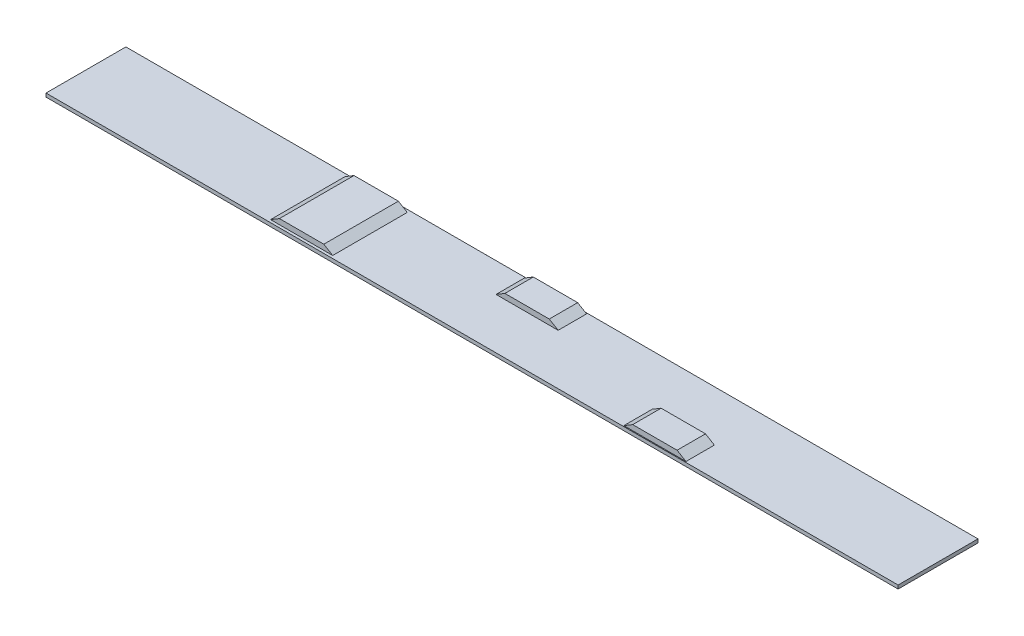
ISO-10303-21;
HEADER;
FILE_DESCRIPTION(('STEP AP214'),'2;1');
FILE_NAME('part.step','',(''),(''),'','','');
FILE_SCHEMA(('AUTOMOTIVE_DESIGN { 1 0 10303 214 1 1 1 1 }'));
ENDSEC;
DATA;
#1=APPLICATION_CONTEXT('core data for automotive mechanical design processes');
#2=APPLICATION_PROTOCOL_DEFINITION('international standard','automotive_design',2000,#1);
#3=PRODUCT_CONTEXT('',#1,'mechanical');
#4=PRODUCT('Part','Part','',(#3));
#5=PRODUCT_RELATED_PRODUCT_CATEGORY('part','',(#4));
#6=PRODUCT_DEFINITION_FORMATION('','',#4);
#7=PRODUCT_DEFINITION_CONTEXT('part definition',#1,'design');
#8=PRODUCT_DEFINITION('design','',#6,#7);
#9=PRODUCT_DEFINITION_SHAPE('','',#8);
#10=(LENGTH_UNIT() NAMED_UNIT(*) SI_UNIT(.MILLI.,.METRE.));
#11=(NAMED_UNIT(*) PLANE_ANGLE_UNIT() SI_UNIT($,.RADIAN.));
#12=(NAMED_UNIT(*) SI_UNIT($,.STERADIAN.) SOLID_ANGLE_UNIT());
#13=UNCERTAINTY_MEASURE_WITH_UNIT(LENGTH_MEASURE(1.E-05),#10,'distance_accuracy_value','');
#14=(GEOMETRIC_REPRESENTATION_CONTEXT(3) GLOBAL_UNCERTAINTY_ASSIGNED_CONTEXT((#13)) GLOBAL_UNIT_ASSIGNED_CONTEXT((#10,
#11,#12)) REPRESENTATION_CONTEXT('',''));
#15=CARTESIAN_POINT('',(0.,0.,0.));
#16=DIRECTION('',(0.,0.,1.));
#17=DIRECTION('',(1.,0.,0.));
#18=AXIS2_PLACEMENT_3D('',#15,#16,#17);
#19=CARTESIAN_POINT('',(0.,10.,0.));
#20=DIRECTION('',(0.,1.,0.));
#21=DIRECTION('',(0.,0.,1.));
#22=AXIS2_PLACEMENT_3D('',#19,#20,#21);
#23=PLANE('',#22);
#24=DIRECTION('',(1.,0.,0.));
#25=VECTOR('',#24,1.);
#26=CARTESIAN_POINT('',(-575.000000000001,9.99999999999651,-105.));
#27=LINE('',#26,#25);
#28=CARTESIAN_POINT('',(-575.000000000001,9.99999999999651,-105.));
#29=VERTEX_POINT('',#28);
#30=CARTESIAN_POINT('',(-400.000000000001,9.99999999999302,-105.));
#31=VERTEX_POINT('',#30);
#32=EDGE_CURVE('E180',#29,#31,#27,.T.);
#33=ORIENTED_EDGE('',*,*,#32,.T.);
#34=DIRECTION('',(0.,0.,1.));
#35=VECTOR('',#34,1.);
#36=CARTESIAN_POINT('',(-400.000000000001,9.99999999999302,-105.));
#37=LINE('',#36,#35);
#38=CARTESIAN_POINT('',(-400.000000000001,9.99999999999302,105.));
#39=VERTEX_POINT('',#38);
#40=EDGE_CURVE('E172',#31,#39,#37,.T.);
#41=ORIENTED_EDGE('',*,*,#40,.T.);
#42=DIRECTION('',(1.,0.,0.));
#43=VECTOR('',#42,1.);
#44=CARTESIAN_POINT('',(-575.000000000001,9.99999999999651,105.));
#45=LINE('',#44,#43);
#46=CARTESIAN_POINT('',(-575.000000000001,10.,105.));
#47=VERTEX_POINT('',#46);
#48=EDGE_CURVE('E159',#47,#39,#45,.T.);
#49=ORIENTED_EDGE('',*,*,#48,.F.);
#50=DIRECTION('',(0.,0.,1.));
#51=VECTOR('',#50,1.);
#52=CARTESIAN_POINT('',(-575.000000000001,9.99999999999651,-105.));
#53=LINE('',#52,#51);
#54=EDGE_CURVE('E182',#29,#47,#53,.T.);
#55=ORIENTED_EDGE('',*,*,#54,.F.);
#56=EDGE_LOOP('',(#33,#41,#49,#55));
#57=FACE_BOUND('',#56,.T.);
#58=DIRECTION('',(0.,0.,-1.));
#59=VECTOR('',#58,1.);
#60=CARTESIAN_POINT('',(1200.,10.,-112.5));
#61=LINE('',#60,#59);
#62=CARTESIAN_POINT('',(1200.,10.,112.5));
#63=VERTEX_POINT('',#62);
#64=CARTESIAN_POINT('',(1200.,10.,-112.5));
#65=VERTEX_POINT('',#64);
#66=EDGE_CURVE('E277',#63,#65,#61,.T.);
#67=ORIENTED_EDGE('',*,*,#66,.T.);
#68=DIRECTION('',(-1.,0.,0.));
#69=VECTOR('',#68,1.);
#70=CARTESIAN_POINT('',(-1200.,10.,-112.5));
#71=LINE('',#70,#69);
#72=CARTESIAN_POINT('',(-1200.,10.,-112.5));
#73=VERTEX_POINT('',#72);
#74=EDGE_CURVE('E281',#65,#73,#71,.T.);
#75=ORIENTED_EDGE('',*,*,#74,.T.);
#76=DIRECTION('',(0.,0.,1.));
#77=VECTOR('',#76,1.);
#78=CARTESIAN_POINT('',(-1200.,10.,-112.5));
#79=LINE('',#78,#77);
#80=CARTESIAN_POINT('',(-1200.,10.,112.5));
#81=VERTEX_POINT('',#80);
#82=EDGE_CURVE('E285',#73,#81,#79,.T.);
#83=ORIENTED_EDGE('',*,*,#82,.T.);
#84=DIRECTION('',(1.,0.,0.));
#85=VECTOR('',#84,1.);
#86=CARTESIAN_POINT('',(-1200.,10.,112.5));
#87=LINE('',#86,#85);
#88=EDGE_CURVE('E288',#81,#63,#87,.T.);
#89=ORIENTED_EDGE('',*,*,#88,.T.);
#90=EDGE_LOOP('',(#67,#75,#83,#89));
#91=FACE_BOUND('',#90,.T.);
#92=DIRECTION('',(0.,0.,-1.));
#93=VECTOR('',#92,1.);
#94=CARTESIAN_POINT('',(599.999999999999,10.,110.));
#95=LINE('',#94,#93);
#96=CARTESIAN_POINT('',(599.999999999999,10.,110.));
#97=VERTEX_POINT('',#96);
#98=CARTESIAN_POINT('',(599.999999999999,10.,30.));
#99=VERTEX_POINT('',#98);
#100=EDGE_CURVE('E269',#97,#99,#95,.T.);
#101=ORIENTED_EDGE('',*,*,#100,.F.);
#102=DIRECTION('',(1.,0.,0.));
#103=VECTOR('',#102,1.);
#104=CARTESIAN_POINT('',(424.999999999999,10.,110.));
#105=LINE('',#104,#103);
#106=CARTESIAN_POINT('',(424.999999999999,10.,110.));
#107=VERTEX_POINT('',#106);
#108=EDGE_CURVE('E239',#107,#97,#105,.T.);
#109=ORIENTED_EDGE('',*,*,#108,.F.);
#110=DIRECTION('',(0.,0.,-1.));
#111=VECTOR('',#110,1.);
#112=CARTESIAN_POINT('',(424.999999999999,10.,110.));
#113=LINE('',#112,#111);
#114=CARTESIAN_POINT('',(424.999999999999,10.,30.));
#115=VERTEX_POINT('',#114);
#116=EDGE_CURVE('E273',#107,#115,#113,.T.);
#117=ORIENTED_EDGE('',*,*,#116,.T.);
#118=DIRECTION('',(1.,0.,0.));
#119=VECTOR('',#118,1.);
#120=CARTESIAN_POINT('',(424.999999999999,10.,30.));
#121=LINE('',#120,#119);
#122=EDGE_CURVE('E254',#115,#99,#121,.T.);
#123=ORIENTED_EDGE('',*,*,#122,.T.);
#124=EDGE_LOOP('',(#101,#109,#117,#123));
#125=FACE_BOUND('',#124,.T.);
#126=DIRECTION('',(0.,0.,1.));
#127=VECTOR('',#126,1.);
#128=CARTESIAN_POINT('',(-75.0000000000013,9.99999999999651,-110.));
#129=LINE('',#128,#127);
#130=CARTESIAN_POINT('',(-74.9999999999955,10.,-110.));
#131=VERTEX_POINT('',#130);
#132=CARTESIAN_POINT('',(-75.0000000000013,10.,-30.));
#133=VERTEX_POINT('',#132);
#134=EDGE_CURVE('E69',#131,#133,#129,.T.);
#135=ORIENTED_EDGE('',*,*,#134,.F.);
#136=DIRECTION('',(1.,0.,0.));
#137=VECTOR('',#136,1.);
#138=CARTESIAN_POINT('',(-75.0000000000013,9.99999999999651,-110.));
#139=LINE('',#138,#137);
#140=CARTESIAN_POINT('',(99.9999999999929,10.,-110.));
#141=VERTEX_POINT('',#140);
#142=EDGE_CURVE('E192',#131,#141,#139,.T.);
#143=ORIENTED_EDGE('',*,*,#142,.T.);
#144=DIRECTION('',(0.,0.,1.));
#145=VECTOR('',#144,1.);
#146=CARTESIAN_POINT('',(99.9999999999987,9.99999999999651,-110.));
#147=LINE('',#146,#145);
#148=CARTESIAN_POINT('',(99.9999999999987,9.99999999999651,-30.));
#149=VERTEX_POINT('',#148);
#150=EDGE_CURVE('E208',#141,#149,#147,.T.);
#151=ORIENTED_EDGE('',*,*,#150,.T.);
#152=DIRECTION('',(1.,0.,0.));
#153=VECTOR('',#152,1.);
#154=CARTESIAN_POINT('',(-75.0000000000013,9.99999999999651,-30.));
#155=LINE('',#154,#153);
#156=EDGE_CURVE('E209',#133,#149,#155,.T.);
#157=ORIENTED_EDGE('',*,*,#156,.F.);
#158=EDGE_LOOP('',(#135,#143,#151,#157));
#159=FACE_BOUND('',#158,.T.);
#160=ADVANCED_FACE('F45',(#57,#91,#125,#159),#23,.T.);
#161=CARTESIAN_POINT('',(1200.,10.,-112.5));
#162=DIRECTION('',(-1.,0.,0.));
#163=DIRECTION('',(0.,0.,1.));
#164=AXIS2_PLACEMENT_3D('',#161,#162,#163);
#165=PLANE('',#164);
#166=DIRECTION('',(0.,0.,-1.));
#167=VECTOR('',#166,1.);
#168=CARTESIAN_POINT('',(1200.,0.,-112.5));
#169=LINE('',#168,#167);
#170=CARTESIAN_POINT('',(1200.,0.,112.5));
#171=VERTEX_POINT('',#170);
#172=CARTESIAN_POINT('',(1200.,0.,-112.5));
#173=VERTEX_POINT('',#172);
#174=EDGE_CURVE('E276',#171,#173,#169,.T.);
#175=ORIENTED_EDGE('',*,*,#174,.T.);
#176=DIRECTION('',(0.,-1.,0.));
#177=VECTOR('',#176,1.);
#178=CARTESIAN_POINT('',(1200.,10.,-112.5));
#179=LINE('',#178,#177);
#180=EDGE_CURVE('E11',#65,#173,#179,.T.);
#181=ORIENTED_EDGE('',*,*,#180,.F.);
#182=ORIENTED_EDGE('',*,*,#66,.F.);
#183=DIRECTION('',(0.,-1.,0.));
#184=VECTOR('',#183,1.);
#185=CARTESIAN_POINT('',(1200.,10.,112.5));
#186=LINE('',#185,#184);
#187=EDGE_CURVE('E291',#63,#171,#186,.T.);
#188=ORIENTED_EDGE('',*,*,#187,.T.);
#189=EDGE_LOOP('',(#175,#181,#182,#188));
#190=FACE_BOUND('',#189,.T.);
#191=ADVANCED_FACE('F47',(#190),#165,.F.);
#192=CARTESIAN_POINT('',(-1200.,10.,-112.5));
#193=DIRECTION('',(0.,0.,1.));
#194=DIRECTION('',(1.,0.,0.));
#195=AXIS2_PLACEMENT_3D('',#192,#193,#194);
#196=PLANE('',#195);
#197=DIRECTION('',(-1.,0.,0.));
#198=VECTOR('',#197,1.);
#199=CARTESIAN_POINT('',(-1200.,0.,-112.5));
#200=LINE('',#199,#198);
#201=CARTESIAN_POINT('',(-1200.,0.,-112.5));
#202=VERTEX_POINT('',#201);
#203=EDGE_CURVE('E295',#173,#202,#200,.T.);
#204=ORIENTED_EDGE('',*,*,#203,.T.);
#205=DIRECTION('',(0.,-1.,0.));
#206=VECTOR('',#205,1.);
#207=CARTESIAN_POINT('',(-1200.,10.,-112.5));
#208=LINE('',#207,#206);
#209=EDGE_CURVE('E54',#73,#202,#208,.T.);
#210=ORIENTED_EDGE('',*,*,#209,.F.);
#211=ORIENTED_EDGE('',*,*,#74,.F.);
#212=ORIENTED_EDGE('',*,*,#180,.T.);
#213=EDGE_LOOP('',(#204,#210,#211,#212));
#214=FACE_BOUND('',#213,.T.);
#215=ADVANCED_FACE('F330',(#214),#196,.F.);
#216=CARTESIAN_POINT('',(-1200.,10.,-112.5));
#217=DIRECTION('',(1.,0.,0.));
#218=DIRECTION('',(0.,0.,-1.));
#219=AXIS2_PLACEMENT_3D('',#216,#217,#218);
#220=PLANE('',#219);
#221=DIRECTION('',(0.,0.,1.));
#222=VECTOR('',#221,1.);
#223=CARTESIAN_POINT('',(-1200.,0.,-112.5));
#224=LINE('',#223,#222);
#225=CARTESIAN_POINT('',(-1200.,0.,112.5));
#226=VERTEX_POINT('',#225);
#227=EDGE_CURVE('E298',#202,#226,#224,.T.);
#228=ORIENTED_EDGE('',*,*,#227,.T.);
#229=DIRECTION('',(0.,-1.,0.));
#230=VECTOR('',#229,1.);
#231=CARTESIAN_POINT('',(-1200.,10.,112.5));
#232=LINE('',#231,#230);
#233=EDGE_CURVE('E306',#81,#226,#232,.T.);
#234=ORIENTED_EDGE('',*,*,#233,.F.);
#235=ORIENTED_EDGE('',*,*,#82,.F.);
#236=ORIENTED_EDGE('',*,*,#209,.T.);
#237=EDGE_LOOP('',(#228,#234,#235,#236));
#238=FACE_BOUND('',#237,.T.);
#239=ADVANCED_FACE('F315',(#238),#220,.F.);
#240=CARTESIAN_POINT('',(-1200.,10.,112.5));
#241=DIRECTION('',(0.,0.,-1.));
#242=DIRECTION('',(-1.,0.,0.));
#243=AXIS2_PLACEMENT_3D('',#240,#241,#242);
#244=PLANE('',#243);
#245=DIRECTION('',(1.,0.,0.));
#246=VECTOR('',#245,1.);
#247=CARTESIAN_POINT('',(-1200.,0.,112.5));
#248=LINE('',#247,#246);
#249=EDGE_CURVE('E282',#226,#171,#248,.T.);
#250=ORIENTED_EDGE('',*,*,#249,.T.);
#251=ORIENTED_EDGE('',*,*,#187,.F.);
#252=ORIENTED_EDGE('',*,*,#88,.F.);
#253=ORIENTED_EDGE('',*,*,#233,.T.);
#254=EDGE_LOOP('',(#250,#251,#252,#253));
#255=FACE_BOUND('',#254,.T.);
#256=ADVANCED_FACE('F324',(#255),#244,.F.);
#257=CARTESIAN_POINT('',(0.,0.,0.));
#258=DIRECTION('',(0.,1.,0.));
#259=DIRECTION('',(0.,0.,1.));
#260=AXIS2_PLACEMENT_3D('',#257,#258,#259);
#261=PLANE('',#260);
#262=ORIENTED_EDGE('',*,*,#174,.F.);
#263=ORIENTED_EDGE('',*,*,#249,.F.);
#264=ORIENTED_EDGE('',*,*,#227,.F.);
#265=ORIENTED_EDGE('',*,*,#203,.F.);
#266=EDGE_LOOP('',(#262,#263,#264,#265));
#267=FACE_BOUND('',#266,.T.);
#268=ADVANCED_FACE('F321',(#267),#261,.F.);
#269=CARTESIAN_POINT('',(449.999999999999,25.,110.));
#270=DIRECTION('',(0.514495755427527,-0.857492925712544,0.));
#271=DIRECTION('',(0.857492925712544,0.514495755427527,0.));
#272=AXIS2_PLACEMENT_3D('',#269,#270,#271);
#273=PLANE('',#272);
#274=DIRECTION('',(-0.857492925712544,-0.514495755427527,0.));
#275=VECTOR('',#274,1.);
#276=CARTESIAN_POINT('',(449.999999999999,25.,30.));
#277=LINE('',#276,#275);
#278=CARTESIAN_POINT('',(449.999999999999,25.,30.));
#279=VERTEX_POINT('',#278);
#280=EDGE_CURVE('E226',#279,#115,#277,.T.);
#281=ORIENTED_EDGE('',*,*,#280,.T.);
#282=ORIENTED_EDGE('',*,*,#116,.F.);
#283=DIRECTION('',(-0.857492925712544,-0.514495755427527,0.));
#284=VECTOR('',#283,1.);
#285=CARTESIAN_POINT('',(449.999999999999,25.,110.));
#286=LINE('',#285,#284);
#287=CARTESIAN_POINT('',(449.999999999999,25.,110.));
#288=VERTEX_POINT('',#287);
#289=EDGE_CURVE('E235',#288,#107,#286,.T.);
#290=ORIENTED_EDGE('',*,*,#289,.F.);
#291=DIRECTION('',(0.,0.,-1.));
#292=VECTOR('',#291,1.);
#293=CARTESIAN_POINT('',(449.999999999999,25.,110.));
#294=LINE('',#293,#292);
#295=EDGE_CURVE('E250',#288,#279,#294,.T.);
#296=ORIENTED_EDGE('',*,*,#295,.T.);
#297=EDGE_LOOP('',(#281,#282,#290,#296));
#298=FACE_BOUND('',#297,.T.);
#299=ADVANCED_FACE('F345',(#298),#273,.F.);
#300=CARTESIAN_POINT('',(599.999999999999,10.,110.));
#301=DIRECTION('',(-0.514495755427527,-0.857492925712544,0.));
#302=DIRECTION('',(0.857492925712544,-0.514495755427527,0.));
#303=AXIS2_PLACEMENT_3D('',#300,#301,#302);
#304=PLANE('',#303);
#305=DIRECTION('',(-0.857492925712544,0.514495755427527,0.));
#306=VECTOR('',#305,1.);
#307=CARTESIAN_POINT('',(599.999999999999,10.,30.));
#308=LINE('',#307,#306);
#309=CARTESIAN_POINT('',(574.999999999999,25.,30.));
#310=VERTEX_POINT('',#309);
#311=EDGE_CURVE('E257',#99,#310,#308,.T.);
#312=ORIENTED_EDGE('',*,*,#311,.T.);
#313=DIRECTION('',(0.,0.,-1.));
#314=VECTOR('',#313,1.);
#315=CARTESIAN_POINT('',(574.999999999999,25.,110.));
#316=LINE('',#315,#314);
#317=CARTESIAN_POINT('',(574.999999999999,25.,110.));
#318=VERTEX_POINT('',#317);
#319=EDGE_CURVE('E265',#318,#310,#316,.T.);
#320=ORIENTED_EDGE('',*,*,#319,.F.);
#321=DIRECTION('',(-0.857492925712544,0.514495755427527,0.));
#322=VECTOR('',#321,1.);
#323=CARTESIAN_POINT('',(599.999999999999,10.,110.));
#324=LINE('',#323,#322);
#325=EDGE_CURVE('E244',#97,#318,#324,.T.);
#326=ORIENTED_EDGE('',*,*,#325,.F.);
#327=ORIENTED_EDGE('',*,*,#100,.T.);
#328=EDGE_LOOP('',(#312,#320,#326,#327));
#329=FACE_BOUND('',#328,.T.);
#330=ADVANCED_FACE('F366',(#329),#304,.F.);
#331=CARTESIAN_POINT('',(574.999999999999,25.,110.));
#332=DIRECTION('',(0.,-1.,0.));
#333=DIRECTION('',(0.,0.,-1.));
#334=AXIS2_PLACEMENT_3D('',#331,#332,#333);
#335=PLANE('',#334);
#336=DIRECTION('',(-1.,0.,0.));
#337=VECTOR('',#336,1.);
#338=CARTESIAN_POINT('',(574.999999999999,25.,30.));
#339=LINE('',#338,#337);
#340=EDGE_CURVE('E240',#310,#279,#339,.T.);
#341=ORIENTED_EDGE('',*,*,#340,.T.);
#342=ORIENTED_EDGE('',*,*,#295,.F.);
#343=DIRECTION('',(-1.,0.,0.));
#344=VECTOR('',#343,1.);
#345=CARTESIAN_POINT('',(574.999999999999,25.,110.));
#346=LINE('',#345,#344);
#347=EDGE_CURVE('E247',#318,#288,#346,.T.);
#348=ORIENTED_EDGE('',*,*,#347,.F.);
#349=ORIENTED_EDGE('',*,*,#319,.T.);
#350=EDGE_LOOP('',(#341,#342,#348,#349));
#351=FACE_BOUND('',#350,.T.);
#352=ADVANCED_FACE('F374',(#351),#335,.F.);
#353=CARTESIAN_POINT('',(0.,0.,110.));
#354=DIRECTION('',(0.,0.,-1.));
#355=DIRECTION('',(-1.,0.,0.));
#356=AXIS2_PLACEMENT_3D('',#353,#354,#355);
#357=PLANE('',#356);
#358=ORIENTED_EDGE('',*,*,#289,.T.);
#359=ORIENTED_EDGE('',*,*,#108,.T.);
#360=ORIENTED_EDGE('',*,*,#325,.T.);
#361=ORIENTED_EDGE('',*,*,#347,.T.);
#362=EDGE_LOOP('',(#358,#359,#360,#361));
#363=FACE_BOUND('',#362,.T.);
#364=ADVANCED_FACE('F382',(#363),#357,.F.);
#365=CARTESIAN_POINT('',(0.,0.,30.));
#366=DIRECTION('',(0.,0.,-1.));
#367=DIRECTION('',(-1.,0.,0.));
#368=AXIS2_PLACEMENT_3D('',#365,#366,#367);
#369=PLANE('',#368);
#370=ORIENTED_EDGE('',*,*,#280,.F.);
#371=ORIENTED_EDGE('',*,*,#340,.F.);
#372=ORIENTED_EDGE('',*,*,#311,.F.);
#373=ORIENTED_EDGE('',*,*,#122,.F.);
#374=EDGE_LOOP('',(#370,#371,#372,#373));
#375=FACE_BOUND('',#374,.T.);
#376=ADVANCED_FACE('F391',(#375),#369,.T.);
#377=CARTESIAN_POINT('',(-50.0000000000013,24.9999999999965,-110.));
#378=DIRECTION('',(-0.514495755427527,0.857492925712544,0.));
#379=DIRECTION('',(-0.857492925712544,-0.514495755427527,0.));
#380=AXIS2_PLACEMENT_3D('',#377,#378,#379);
#381=PLANE('',#380);
#382=DIRECTION('',(-0.857492925712544,-0.514495755427527,0.));
#383=VECTOR('',#382,1.);
#384=CARTESIAN_POINT('',(-50.0000000000013,24.9999999999965,-30.));
#385=LINE('',#384,#383);
#386=CARTESIAN_POINT('',(-50.0000000000013,24.9999999999965,-30.));
#387=VERTEX_POINT('',#386);
#388=EDGE_CURVE('E196',#387,#133,#385,.T.);
#389=ORIENTED_EDGE('',*,*,#388,.F.);
#390=DIRECTION('',(0.,0.,1.));
#391=VECTOR('',#390,1.);
#392=CARTESIAN_POINT('',(-50.0000000000013,24.9999999999965,-110.));
#393=LINE('',#392,#391);
#394=CARTESIAN_POINT('',(-50.0000000000013,24.9999999999965,-110.));
#395=VERTEX_POINT('',#394);
#396=EDGE_CURVE('E227',#395,#387,#393,.T.);
#397=ORIENTED_EDGE('',*,*,#396,.F.);
#398=DIRECTION('',(-0.857492925712544,-0.514495755427527,0.));
#399=VECTOR('',#398,1.);
#400=CARTESIAN_POINT('',(-50.0000000000013,24.9999999999965,-110.));
#401=LINE('',#400,#399);
#402=EDGE_CURVE('E204',#395,#131,#401,.T.);
#403=ORIENTED_EDGE('',*,*,#402,.T.);
#404=ORIENTED_EDGE('',*,*,#134,.T.);
#405=EDGE_LOOP('',(#389,#397,#403,#404));
#406=FACE_BOUND('',#405,.T.);
#407=ADVANCED_FACE('F400',(#406),#381,.T.);
#408=CARTESIAN_POINT('',(74.9999999999987,24.9999999999965,-110.));
#409=DIRECTION('',(0.,1.,0.));
#410=DIRECTION('',(0.,0.,1.));
#411=AXIS2_PLACEMENT_3D('',#408,#409,#410);
#412=PLANE('',#411);
#413=DIRECTION('',(-1.,0.,0.));
#414=VECTOR('',#413,1.);
#415=CARTESIAN_POINT('',(74.9999999999987,24.9999999999965,-30.));
#416=LINE('',#415,#414);
#417=CARTESIAN_POINT('',(74.9999999999987,24.9999999999965,-30.));
#418=VERTEX_POINT('',#417);
#419=EDGE_CURVE('E217',#418,#387,#416,.T.);
#420=ORIENTED_EDGE('',*,*,#419,.F.);
#421=DIRECTION('',(0.,0.,1.));
#422=VECTOR('',#421,1.);
#423=CARTESIAN_POINT('',(74.9999999999987,24.9999999999965,-110.));
#424=LINE('',#423,#422);
#425=CARTESIAN_POINT('',(74.9999999999987,24.9999999999965,-110.));
#426=VERTEX_POINT('',#425);
#427=EDGE_CURVE('E230',#426,#418,#424,.T.);
#428=ORIENTED_EDGE('',*,*,#427,.F.);
#429=DIRECTION('',(-1.,0.,0.));
#430=VECTOR('',#429,1.);
#431=CARTESIAN_POINT('',(74.9999999999987,24.9999999999965,-110.));
#432=LINE('',#431,#430);
#433=EDGE_CURVE('E200',#426,#395,#432,.T.);
#434=ORIENTED_EDGE('',*,*,#433,.T.);
#435=ORIENTED_EDGE('',*,*,#396,.T.);
#436=EDGE_LOOP('',(#420,#428,#434,#435));
#437=FACE_BOUND('',#436,.T.);
#438=ADVANCED_FACE('F409',(#437),#412,.T.);
#439=CARTESIAN_POINT('',(99.9999999999987,9.99999999999651,-110.));
#440=DIRECTION('',(0.514495755427527,0.857492925712544,0.));
#441=DIRECTION('',(-0.857492925712544,0.514495755427527,0.));
#442=AXIS2_PLACEMENT_3D('',#439,#440,#441);
#443=PLANE('',#442);
#444=DIRECTION('',(-0.857492925712544,0.514495755427527,0.));
#445=VECTOR('',#444,1.);
#446=CARTESIAN_POINT('',(99.9999999999987,9.99999999999651,-30.));
#447=LINE('',#446,#445);
#448=EDGE_CURVE('E213',#149,#418,#447,.T.);
#449=ORIENTED_EDGE('',*,*,#448,.F.);
#450=ORIENTED_EDGE('',*,*,#150,.F.);
#451=DIRECTION('',(-0.857492925712544,0.514495755427527,0.));
#452=VECTOR('',#451,1.);
#453=CARTESIAN_POINT('',(99.9999999999987,9.99999999999651,-110.));
#454=LINE('',#453,#452);
#455=EDGE_CURVE('E195',#141,#426,#454,.T.);
#456=ORIENTED_EDGE('',*,*,#455,.T.);
#457=ORIENTED_EDGE('',*,*,#427,.T.);
#458=EDGE_LOOP('',(#449,#450,#456,#457));
#459=FACE_BOUND('',#458,.T.);
#460=ADVANCED_FACE('F418',(#459),#443,.T.);
#461=CARTESIAN_POINT('',(0.,0.,-110.));
#462=DIRECTION('',(0.,0.,1.));
#463=DIRECTION('',(1.,0.,0.));
#464=AXIS2_PLACEMENT_3D('',#461,#462,#463);
#465=PLANE('',#464);
#466=ORIENTED_EDGE('',*,*,#142,.F.);
#467=ORIENTED_EDGE('',*,*,#402,.F.);
#468=ORIENTED_EDGE('',*,*,#433,.F.);
#469=ORIENTED_EDGE('',*,*,#455,.F.);
#470=EDGE_LOOP('',(#466,#467,#468,#469));
#471=FACE_BOUND('',#470,.T.);
#472=ADVANCED_FACE('F427',(#471),#465,.F.);
#473=CARTESIAN_POINT('',(0.,0.,-30.));
#474=DIRECTION('',(0.,0.,1.));
#475=DIRECTION('',(1.,0.,0.));
#476=AXIS2_PLACEMENT_3D('',#473,#474,#475);
#477=PLANE('',#476);
#478=ORIENTED_EDGE('',*,*,#156,.T.);
#479=ORIENTED_EDGE('',*,*,#448,.T.);
#480=ORIENTED_EDGE('',*,*,#419,.T.);
#481=ORIENTED_EDGE('',*,*,#388,.T.);
#482=EDGE_LOOP('',(#478,#479,#480,#481));
#483=FACE_BOUND('',#482,.T.);
#484=ADVANCED_FACE('F435',(#483),#477,.T.);
#485=CARTESIAN_POINT('',(-550.000000000001,24.999999999993,-105.));
#486=DIRECTION('',(-0.514495755427439,0.857492925712597,0.));
#487=DIRECTION('',(-0.857492925712597,-0.514495755427439,0.));
#488=AXIS2_PLACEMENT_3D('',#485,#486,#487);
#489=PLANE('',#488);
#490=ORIENTED_EDGE('',*,*,#54,.T.);
#491=DIRECTION('',(-0.857492925712597,-0.514495755427439,0.));
#492=VECTOR('',#491,1.);
#493=CARTESIAN_POINT('',(-550.000000000001,24.999999999993,105.));
#494=LINE('',#493,#492);
#495=CARTESIAN_POINT('',(-550.000000000001,24.999999999993,105.));
#496=VERTEX_POINT('',#495);
#497=EDGE_CURVE('E61',#496,#47,#494,.T.);
#498=ORIENTED_EDGE('',*,*,#497,.F.);
#499=DIRECTION('',(0.,0.,1.));
#500=VECTOR('',#499,1.);
#501=CARTESIAN_POINT('',(-550.000000000001,24.999999999993,-105.));
#502=LINE('',#501,#500);
#503=CARTESIAN_POINT('',(-550.000000000001,24.999999999993,-105.));
#504=VERTEX_POINT('',#503);
#505=EDGE_CURVE('E186',#504,#496,#502,.T.);
#506=ORIENTED_EDGE('',*,*,#505,.F.);
#507=DIRECTION('',(-0.857492925712597,-0.514495755427439,0.));
#508=VECTOR('',#507,1.);
#509=CARTESIAN_POINT('',(-550.000000000001,24.999999999993,-105.));
#510=LINE('',#509,#508);
#511=EDGE_CURVE('E497',#504,#29,#510,.T.);
#512=ORIENTED_EDGE('',*,*,#511,.T.);
#513=EDGE_LOOP('',(#490,#498,#506,#512));
#514=FACE_BOUND('',#513,.T.);
#515=ADVANCED_FACE('F443',(#514),#489,.T.);
#516=CARTESIAN_POINT('',(-425.000000000001,24.999999999993,-105.));
#517=DIRECTION('',(0.,1.,0.));
#518=DIRECTION('',(0.,0.,1.));
#519=AXIS2_PLACEMENT_3D('',#516,#517,#518);
#520=PLANE('',#519);
#521=ORIENTED_EDGE('',*,*,#505,.T.);
#522=DIRECTION('',(-1.,0.,0.));
#523=VECTOR('',#522,1.);
#524=CARTESIAN_POINT('',(-425.000000000001,24.999999999993,105.));
#525=LINE('',#524,#523);
#526=CARTESIAN_POINT('',(-425.000000000001,24.999999999993,105.));
#527=VERTEX_POINT('',#526);
#528=EDGE_CURVE('E176',#527,#496,#525,.T.);
#529=ORIENTED_EDGE('',*,*,#528,.F.);
#530=DIRECTION('',(0.,0.,1.));
#531=VECTOR('',#530,1.);
#532=CARTESIAN_POINT('',(-425.000000000001,24.999999999993,-105.));
#533=LINE('',#532,#531);
#534=CARTESIAN_POINT('',(-425.000000000001,24.999999999993,-105.));
#535=VERTEX_POINT('',#534);
#536=EDGE_CURVE('E174',#535,#527,#533,.T.);
#537=ORIENTED_EDGE('',*,*,#536,.F.);
#538=DIRECTION('',(-1.,0.,0.));
#539=VECTOR('',#538,1.);
#540=CARTESIAN_POINT('',(-425.000000000001,24.999999999993,-105.));
#541=LINE('',#540,#539);
#542=EDGE_CURVE('E188',#535,#504,#541,.T.);
#543=ORIENTED_EDGE('',*,*,#542,.T.);
#544=EDGE_LOOP('',(#521,#529,#537,#543));
#545=FACE_BOUND('',#544,.T.);
#546=ADVANCED_FACE('F455',(#545),#520,.T.);
#547=CARTESIAN_POINT('',(-400.000000000001,9.99999999999302,-105.));
#548=DIRECTION('',(0.514495755427527,0.857492925712544,0.));
#549=DIRECTION('',(-0.857492925712544,0.514495755427527,0.));
#550=AXIS2_PLACEMENT_3D('',#547,#548,#549);
#551=PLANE('',#550);
#552=ORIENTED_EDGE('',*,*,#536,.T.);
#553=DIRECTION('',(-0.857492925712544,0.514495755427527,0.));
#554=VECTOR('',#553,1.);
#555=CARTESIAN_POINT('',(-400.000000000001,9.99999999999302,105.));
#556=LINE('',#555,#554);
#557=EDGE_CURVE('E162',#39,#527,#556,.T.);
#558=ORIENTED_EDGE('',*,*,#557,.F.);
#559=ORIENTED_EDGE('',*,*,#40,.F.);
#560=DIRECTION('',(-0.857492925712544,0.514495755427527,0.));
#561=VECTOR('',#560,1.);
#562=CARTESIAN_POINT('',(-400.000000000001,9.99999999999302,-105.));
#563=LINE('',#562,#561);
#564=EDGE_CURVE('E502',#31,#535,#563,.T.);
#565=ORIENTED_EDGE('',*,*,#564,.T.);
#566=EDGE_LOOP('',(#552,#558,#559,#565));
#567=FACE_BOUND('',#566,.T.);
#568=ADVANCED_FACE('F170',(#567),#551,.T.);
#569=CARTESIAN_POINT('',(0.,0.,-105.));
#570=DIRECTION('',(0.,0.,-1.));
#571=DIRECTION('',(-1.,0.,0.));
#572=AXIS2_PLACEMENT_3D('',#569,#570,#571);
#573=PLANE('',#572);
#574=ORIENTED_EDGE('',*,*,#511,.F.);
#575=ORIENTED_EDGE('',*,*,#542,.F.);
#576=ORIENTED_EDGE('',*,*,#564,.F.);
#577=ORIENTED_EDGE('',*,*,#32,.F.);
#578=EDGE_LOOP('',(#574,#575,#576,#577));
#579=FACE_BOUND('',#578,.T.);
#580=ADVANCED_FACE('F474',(#579),#573,.T.);
#581=CARTESIAN_POINT('',(0.,0.,105.));
#582=DIRECTION('',(0.,0.,-1.));
#583=DIRECTION('',(-1.,0.,0.));
#584=AXIS2_PLACEMENT_3D('',#581,#582,#583);
#585=PLANE('',#584);
#586=ORIENTED_EDGE('',*,*,#497,.T.);
#587=ORIENTED_EDGE('',*,*,#48,.T.);
#588=ORIENTED_EDGE('',*,*,#557,.T.);
#589=ORIENTED_EDGE('',*,*,#528,.T.);
#590=EDGE_LOOP('',(#586,#587,#588,#589));
#591=FACE_BOUND('',#590,.T.);
#592=ADVANCED_FACE('F161',(#591),#585,.F.);
#593=CLOSED_SHELL('',(#160,#191,#215,#239,#256,#268,#299,#330,#352,#364,#376,#407,#438,#460,
#472,#484,#515,#546,#568,#580,#592));
#594=MANIFOLD_SOLID_BREP('B2',#593);
#595=ADVANCED_BREP_SHAPE_REPRESENTATION('',(#18,#594),#14);
#596=SHAPE_DEFINITION_REPRESENTATION(#9,#595);
ENDSEC;
END-ISO-10303-21;
